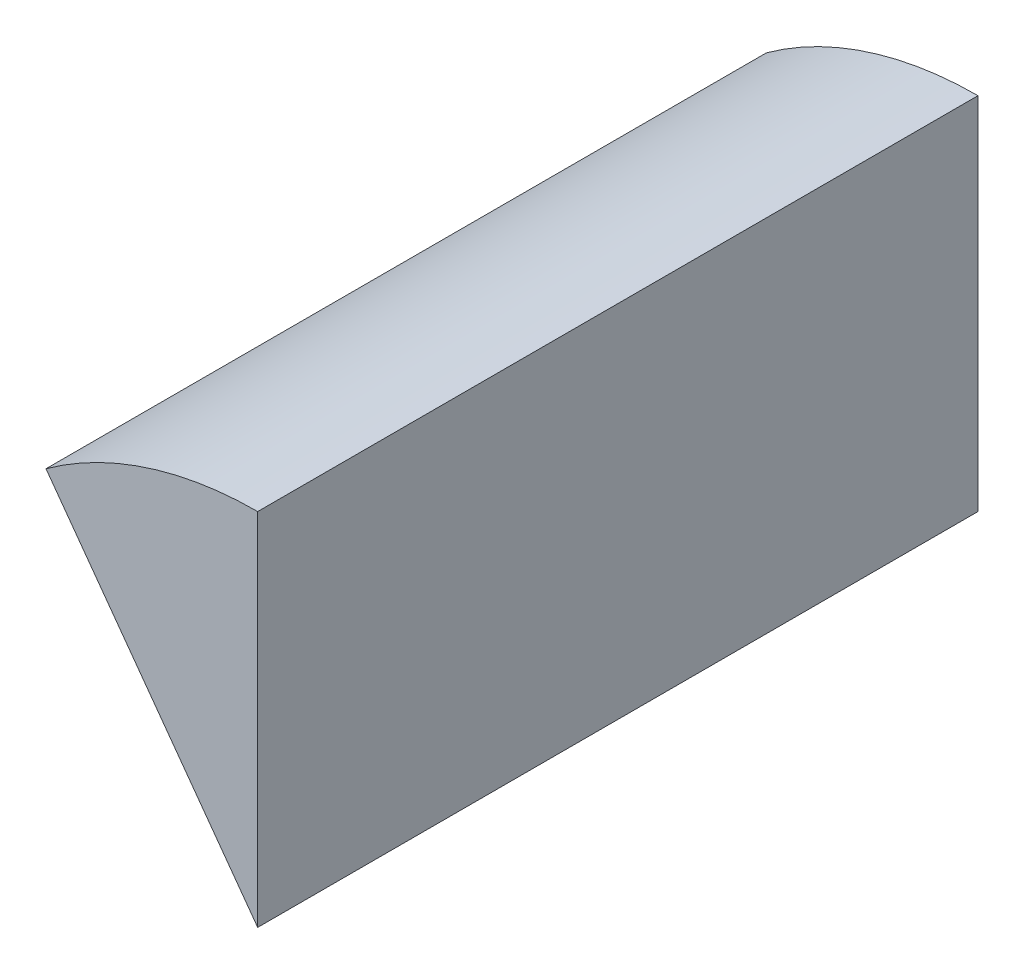
ISO-10303-21;
HEADER;
FILE_DESCRIPTION(('STEP AP214'),'2;1');
FILE_NAME('part.step','',(''),(''),'','','');
FILE_SCHEMA(('AUTOMOTIVE_DESIGN { 1 0 10303 214 1 1 1 1 }'));
ENDSEC;
DATA;
#1=APPLICATION_CONTEXT('core data for automotive mechanical design processes');
#2=APPLICATION_PROTOCOL_DEFINITION('international standard','automotive_design',2000,#1);
#3=PRODUCT_CONTEXT('',#1,'mechanical');
#4=PRODUCT('Part','Part','',(#3));
#5=PRODUCT_RELATED_PRODUCT_CATEGORY('part','',(#4));
#6=PRODUCT_DEFINITION_FORMATION('','',#4);
#7=PRODUCT_DEFINITION_CONTEXT('part definition',#1,'design');
#8=PRODUCT_DEFINITION('design','',#6,#7);
#9=PRODUCT_DEFINITION_SHAPE('','',#8);
#10=(LENGTH_UNIT() NAMED_UNIT(*) SI_UNIT(.MILLI.,.METRE.));
#11=(NAMED_UNIT(*) PLANE_ANGLE_UNIT() SI_UNIT($,.RADIAN.));
#12=(NAMED_UNIT(*) SI_UNIT($,.STERADIAN.) SOLID_ANGLE_UNIT());
#13=UNCERTAINTY_MEASURE_WITH_UNIT(LENGTH_MEASURE(1.E-05),#10,'distance_accuracy_value','');
#14=(GEOMETRIC_REPRESENTATION_CONTEXT(3) GLOBAL_UNCERTAINTY_ASSIGNED_CONTEXT((#13)) GLOBAL_UNIT_ASSIGNED_CONTEXT((#10,
#11,#12)) REPRESENTATION_CONTEXT('',''));
#15=CARTESIAN_POINT('',(0.,0.,0.));
#16=DIRECTION('',(0.,0.,1.));
#17=DIRECTION('',(1.,0.,0.));
#18=AXIS2_PLACEMENT_3D('',#15,#16,#17);
#19=CARTESIAN_POINT('',(0.,0.,50.));
#20=DIRECTION('',(0.809016994374951,0.587785252292469,0.));
#21=DIRECTION('',(-0.587785252292469,0.809016994374951,0.));
#22=AXIS2_PLACEMENT_3D('',#19,#20,#21);
#23=PLANE('',#22);
#24=DIRECTION('',(0.587785252292469,-0.809016994374951,0.));
#25=VECTOR('',#24,1.);
#26=CARTESIAN_POINT('',(0.,0.,0.));
#27=LINE('',#26,#25);
#28=CARTESIAN_POINT('',(-14.6946313073117,20.2254248593738,0.));
#29=VERTEX_POINT('',#28);
#30=CARTESIAN_POINT('',(0.,0.,0.));
#31=VERTEX_POINT('',#30);
#32=EDGE_CURVE('E80',#29,#31,#27,.T.);
#33=ORIENTED_EDGE('',*,*,#32,.T.);
#34=DIRECTION('',(0.,0.,-1.));
#35=VECTOR('',#34,1.);
#36=CARTESIAN_POINT('',(0.,0.,50.));
#37=LINE('',#36,#35);
#38=CARTESIAN_POINT('',(0.,0.,50.));
#39=VERTEX_POINT('',#38);
#40=EDGE_CURVE('E11',#39,#31,#37,.T.);
#41=ORIENTED_EDGE('',*,*,#40,.F.);
#42=DIRECTION('',(0.587785252292469,-0.809016994374951,0.));
#43=VECTOR('',#42,1.);
#44=CARTESIAN_POINT('',(0.,0.,50.));
#45=LINE('',#44,#43);
#46=CARTESIAN_POINT('',(-14.6946313073117,20.2254248593738,50.));
#47=VERTEX_POINT('',#46);
#48=EDGE_CURVE('E73',#47,#39,#45,.T.);
#49=ORIENTED_EDGE('',*,*,#48,.F.);
#50=DIRECTION('',(0.,0.,-1.));
#51=VECTOR('',#50,1.);
#52=CARTESIAN_POINT('',(-14.6946313073117,20.2254248593738,50.));
#53=LINE('',#52,#51);
#54=EDGE_CURVE('E81',#47,#29,#53,.T.);
#55=ORIENTED_EDGE('',*,*,#54,.T.);
#56=EDGE_LOOP('',(#33,#41,#49,#55));
#57=FACE_BOUND('',#56,.T.);
#58=ADVANCED_FACE('F33',(#57),#23,.F.);
#59=CARTESIAN_POINT('',(0.,25.,50.));
#60=DIRECTION('',(-1.,0.,0.));
#61=DIRECTION('',(0.,0.,1.));
#62=AXIS2_PLACEMENT_3D('',#59,#60,#61);
#63=PLANE('',#62);
#64=DIRECTION('',(0.,1.,0.));
#65=VECTOR('',#64,1.);
#66=CARTESIAN_POINT('',(0.,25.,0.));
#67=LINE('',#66,#65);
#68=CARTESIAN_POINT('',(0.,25.,0.));
#69=VERTEX_POINT('',#68);
#70=EDGE_CURVE('E61',#31,#69,#67,.T.);
#71=ORIENTED_EDGE('',*,*,#70,.T.);
#72=DIRECTION('',(0.,0.,-1.));
#73=VECTOR('',#72,1.);
#74=CARTESIAN_POINT('',(0.,25.,50.));
#75=LINE('',#74,#73);
#76=CARTESIAN_POINT('',(0.,25.,50.));
#77=VERTEX_POINT('',#76);
#78=EDGE_CURVE('E41',#77,#69,#75,.T.);
#79=ORIENTED_EDGE('',*,*,#78,.F.);
#80=DIRECTION('',(0.,1.,0.));
#81=VECTOR('',#80,1.);
#82=CARTESIAN_POINT('',(0.,25.,50.));
#83=LINE('',#82,#81);
#84=EDGE_CURVE('E69',#39,#77,#83,.T.);
#85=ORIENTED_EDGE('',*,*,#84,.F.);
#86=ORIENTED_EDGE('',*,*,#40,.T.);
#87=EDGE_LOOP('',(#71,#79,#85,#86));
#88=FACE_BOUND('',#87,.T.);
#89=ADVANCED_FACE('F70',(#88),#63,.F.);
#90=CARTESIAN_POINT('',(0.,0.,50.));
#91=DIRECTION('',(0.,0.,-1.));
#92=DIRECTION('',(-1.,0.,0.));
#93=AXIS2_PLACEMENT_3D('',#90,#91,#92);
#94=CYLINDRICAL_SURFACE('',#93,25.);
#95=CARTESIAN_POINT('',(0.,0.,0.));
#96=DIRECTION('',(0.,0.,1.));
#97=DIRECTION('',(1.,0.,0.));
#98=AXIS2_PLACEMENT_3D('',#95,#96,#97);
#99=CIRCLE('',#98,25.);
#100=EDGE_CURVE('E66',#69,#29,#99,.T.);
#101=ORIENTED_EDGE('',*,*,#100,.T.);
#102=ORIENTED_EDGE('',*,*,#54,.F.);
#103=CARTESIAN_POINT('',(0.,0.,50.));
#104=DIRECTION('',(0.,0.,1.));
#105=DIRECTION('',(1.,0.,0.));
#106=AXIS2_PLACEMENT_3D('',#103,#104,#105);
#107=CIRCLE('',#106,25.);
#108=EDGE_CURVE('E49',#77,#47,#107,.T.);
#109=ORIENTED_EDGE('',*,*,#108,.F.);
#110=ORIENTED_EDGE('',*,*,#78,.T.);
#111=EDGE_LOOP('',(#101,#102,#109,#110));
#112=FACE_BOUND('',#111,.T.);
#113=ADVANCED_FACE('F92',(#112),#94,.T.);
#114=CARTESIAN_POINT('',(0.,0.,50.));
#115=DIRECTION('',(0.,0.,1.));
#116=DIRECTION('',(1.,0.,0.));
#117=AXIS2_PLACEMENT_3D('',#114,#115,#116);
#118=PLANE('',#117);
#119=ORIENTED_EDGE('',*,*,#48,.T.);
#120=ORIENTED_EDGE('',*,*,#84,.T.);
#121=ORIENTED_EDGE('',*,*,#108,.T.);
#122=EDGE_LOOP('',(#119,#120,#121));
#123=FACE_BOUND('',#122,.T.);
#124=ADVANCED_FACE('F76',(#123),#118,.T.);
#125=CARTESIAN_POINT('',(0.,0.,0.));
#126=DIRECTION('',(0.,0.,1.));
#127=DIRECTION('',(1.,0.,0.));
#128=AXIS2_PLACEMENT_3D('',#125,#126,#127);
#129=PLANE('',#128);
#130=CARTESIAN_POINT('',(-5.82569074846023,18.3772761963183,0.));
#131=DIRECTION('',(0.,0.,-1.));
#132=DIRECTION('',(-1.,0.,0.));
#133=AXIS2_PLACEMENT_3D('',#130,#131,#132);
#134=CIRCLE('',#133,5.);
#135=CARTESIAN_POINT('',(-10.8256907484602,18.3772761963183,0.));
#136=VERTEX_POINT('',#135);
#137=EDGE_CURVE('E87',#136,#136,#134,.T.);
#138=ORIENTED_EDGE('',*,*,#137,.F.);
#139=EDGE_LOOP('',(#138));
#140=FACE_BOUND('',#139,.T.);
#141=ORIENTED_EDGE('',*,*,#32,.F.);
#142=ORIENTED_EDGE('',*,*,#100,.F.);
#143=ORIENTED_EDGE('',*,*,#70,.F.);
#144=EDGE_LOOP('',(#141,#142,#143));
#145=FACE_BOUND('',#144,.T.);
#146=ADVANCED_FACE('F93',(#140,#145),#129,.F.);
#147=CARTESIAN_POINT('',(-5.82569074846023,18.3772761963183,10.));
#148=DIRECTION('',(0.,0.,-1.));
#149=DIRECTION('',(-1.,0.,0.));
#150=AXIS2_PLACEMENT_3D('',#147,#148,#149);
#151=CYLINDRICAL_SURFACE('',#150,5.);
#152=CARTESIAN_POINT('',(-5.82569074846023,18.3772761963183,10.));
#153=DIRECTION('',(0.,0.,-1.));
#154=DIRECTION('',(-1.,0.,0.));
#155=AXIS2_PLACEMENT_3D('',#152,#153,#154);
#156=CIRCLE('',#155,5.);
#157=CARTESIAN_POINT('',(-10.8256907484602,18.3772761963183,10.));
#158=VERTEX_POINT('',#157);
#159=EDGE_CURVE('E83',#158,#158,#156,.T.);
#160=ORIENTED_EDGE('',*,*,#159,.F.);
#161=EDGE_LOOP('',(#160));
#162=FACE_BOUND('',#161,.T.);
#163=ORIENTED_EDGE('',*,*,#137,.T.);
#164=EDGE_LOOP('',(#163));
#165=FACE_BOUND('',#164,.T.);
#166=ADVANCED_FACE('F95',(#162,#165),#151,.F.);
#167=CARTESIAN_POINT('',(-5.82569074846023,18.3772761963183,10.));
#168=DIRECTION('',(0.,0.,-1.));
#169=DIRECTION('',(-1.,0.,0.));
#170=AXIS2_PLACEMENT_3D('',#167,#168,#169);
#171=PLANE('',#170);
#172=ORIENTED_EDGE('',*,*,#159,.T.);
#173=EDGE_LOOP('',(#172));
#174=FACE_BOUND('',#173,.T.);
#175=ADVANCED_FACE('F102',(#174),#171,.T.);
#176=CLOSED_SHELL('',(#58,#89,#113,#124,#146,#166,#175));
#177=MANIFOLD_SOLID_BREP('B2',#176);
#178=ADVANCED_BREP_SHAPE_REPRESENTATION('',(#18,#177),#14);
#179=SHAPE_DEFINITION_REPRESENTATION(#9,#178);
ENDSEC;
END-ISO-10303-21;
